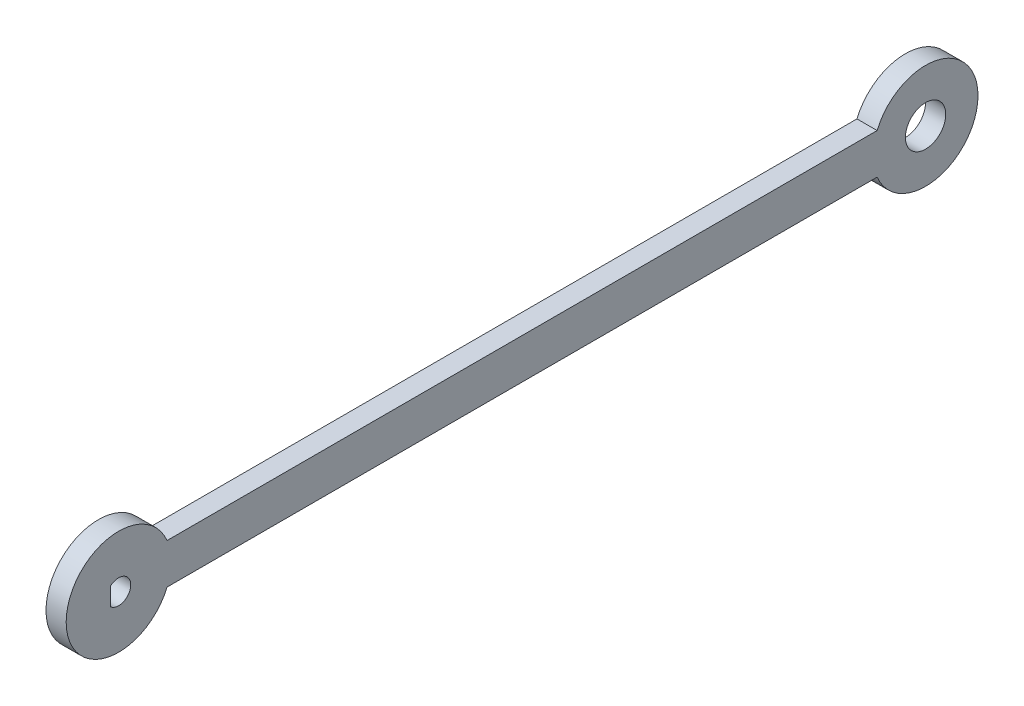
ISO-10303-21;
HEADER;
FILE_DESCRIPTION(('STEP AP214'),'2;1');
FILE_NAME('part.step','',(''),(''),'','','');
FILE_SCHEMA(('AUTOMOTIVE_DESIGN { 1 0 10303 214 1 1 1 1 }'));
ENDSEC;
DATA;
#1=APPLICATION_CONTEXT('core data for automotive mechanical design processes');
#2=APPLICATION_PROTOCOL_DEFINITION('international standard','automotive_design',2000,#1);
#3=PRODUCT_CONTEXT('',#1,'mechanical');
#4=PRODUCT('Part','Part','',(#3));
#5=PRODUCT_RELATED_PRODUCT_CATEGORY('part','',(#4));
#6=PRODUCT_DEFINITION_FORMATION('','',#4);
#7=PRODUCT_DEFINITION_CONTEXT('part definition',#1,'design');
#8=PRODUCT_DEFINITION('design','',#6,#7);
#9=PRODUCT_DEFINITION_SHAPE('','',#8);
#10=(LENGTH_UNIT() NAMED_UNIT(*) SI_UNIT(.MILLI.,.METRE.));
#11=(NAMED_UNIT(*) PLANE_ANGLE_UNIT() SI_UNIT($,.RADIAN.));
#12=(NAMED_UNIT(*) SI_UNIT($,.STERADIAN.) SOLID_ANGLE_UNIT());
#13=UNCERTAINTY_MEASURE_WITH_UNIT(LENGTH_MEASURE(1.E-05),#10,'distance_accuracy_value','');
#14=(GEOMETRIC_REPRESENTATION_CONTEXT(3) GLOBAL_UNCERTAINTY_ASSIGNED_CONTEXT((#13)) GLOBAL_UNIT_ASSIGNED_CONTEXT((#10,
#11,#12)) REPRESENTATION_CONTEXT('',''));
#15=CARTESIAN_POINT('',(0.,0.,0.));
#16=DIRECTION('',(0.,0.,1.));
#17=DIRECTION('',(1.,0.,0.));
#18=AXIS2_PLACEMENT_3D('',#15,#16,#17);
#19=CARTESIAN_POINT('',(5.,0.,-200.));
#20=DIRECTION('',(1.,0.,0.));
#21=DIRECTION('',(0.,0.,-1.));
#22=AXIS2_PLACEMENT_3D('',#19,#20,#21);
#23=PLANE('',#22);
#24=DIRECTION('',(0.,-1.,0.));
#25=VECTOR('',#24,1.);
#26=CARTESIAN_POINT('',(5.,0.,2.));
#27=LINE('',#26,#25);
#28=CARTESIAN_POINT('',(5.,2.23606797749979,2.));
#29=VERTEX_POINT('',#28);
#30=CARTESIAN_POINT('',(5.,-2.23606797749979,2.));
#31=VERTEX_POINT('',#30);
#32=EDGE_CURVE('E84',#29,#31,#27,.T.);
#33=ORIENTED_EDGE('',*,*,#32,.F.);
#34=CARTESIAN_POINT('',(5.,0.,0.));
#35=DIRECTION('',(1.,0.,0.));
#36=DIRECTION('',(0.,0.,-1.));
#37=AXIS2_PLACEMENT_3D('',#34,#35,#36);
#38=CIRCLE('',#37,3.);
#39=EDGE_CURVE('E90',#31,#29,#38,.T.);
#40=ORIENTED_EDGE('',*,*,#39,.F.);
#41=EDGE_LOOP('',(#33,#40));
#42=FACE_BOUND('',#41,.T.);
#43=CARTESIAN_POINT('',(5.,0.,-200.));
#44=DIRECTION('',(1.,0.,0.));
#45=DIRECTION('',(0.,0.,-1.));
#46=AXIS2_PLACEMENT_3D('',#43,#44,#45);
#47=CIRCLE('',#46,13.);
#48=CARTESIAN_POINT('',(5.,-5.,-188.));
#49=VERTEX_POINT('',#48);
#50=CARTESIAN_POINT('',(5.,5.,-188.));
#51=VERTEX_POINT('',#50);
#52=EDGE_CURVE('E106',#49,#51,#47,.T.);
#53=ORIENTED_EDGE('',*,*,#52,.T.);
#54=DIRECTION('',(0.,0.,1.));
#55=VECTOR('',#54,1.);
#56=CARTESIAN_POINT('',(5.,5.,-188.));
#57=LINE('',#56,#55);
#58=CARTESIAN_POINT('',(5.,5.,-12.));
#59=VERTEX_POINT('',#58);
#60=EDGE_CURVE('E109',#51,#59,#57,.T.);
#61=ORIENTED_EDGE('',*,*,#60,.T.);
#62=CARTESIAN_POINT('',(5.,0.,0.));
#63=DIRECTION('',(1.,0.,0.));
#64=DIRECTION('',(0.,0.,-1.));
#65=AXIS2_PLACEMENT_3D('',#62,#63,#64);
#66=CIRCLE('',#65,13.);
#67=CARTESIAN_POINT('',(5.,-5.,-12.));
#68=VERTEX_POINT('',#67);
#69=EDGE_CURVE('E112',#59,#68,#66,.T.);
#70=ORIENTED_EDGE('',*,*,#69,.T.);
#71=DIRECTION('',(0.,0.,-1.));
#72=VECTOR('',#71,1.);
#73=CARTESIAN_POINT('',(5.,-5.,-188.));
#74=LINE('',#73,#72);
#75=EDGE_CURVE('E114',#68,#49,#74,.T.);
#76=ORIENTED_EDGE('',*,*,#75,.T.);
#77=EDGE_LOOP('',(#53,#61,#70,#76));
#78=FACE_BOUND('',#77,.T.);
#79=CARTESIAN_POINT('',(5.,0.,-200.));
#80=DIRECTION('',(1.,0.,0.));
#81=DIRECTION('',(0.,0.,-1.));
#82=AXIS2_PLACEMENT_3D('',#79,#80,#81);
#83=CIRCLE('',#82,4.99999999999999);
#84=CARTESIAN_POINT('',(5.,0.,-205.));
#85=VERTEX_POINT('',#84);
#86=EDGE_CURVE('E102',#85,#85,#83,.T.);
#87=ORIENTED_EDGE('',*,*,#86,.F.);
#88=EDGE_LOOP('',(#87));
#89=FACE_BOUND('',#88,.T.);
#90=ADVANCED_FACE('F32',(#42,#78,#89),#23,.T.);
#91=CARTESIAN_POINT('',(0.,0.,-200.));
#92=DIRECTION('',(1.,0.,0.));
#93=DIRECTION('',(0.,0.,-1.));
#94=AXIS2_PLACEMENT_3D('',#91,#92,#93);
#95=PLANE('',#94);
#96=CARTESIAN_POINT('',(0.,0.,-200.));
#97=DIRECTION('',(1.,0.,0.));
#98=DIRECTION('',(0.,0.,-1.));
#99=AXIS2_PLACEMENT_3D('',#96,#97,#98);
#100=CIRCLE('',#99,13.);
#101=CARTESIAN_POINT('',(0.,-5.,-188.));
#102=VERTEX_POINT('',#101);
#103=CARTESIAN_POINT('',(0.,5.,-188.));
#104=VERTEX_POINT('',#103);
#105=EDGE_CURVE('E105',#102,#104,#100,.T.);
#106=ORIENTED_EDGE('',*,*,#105,.F.);
#107=DIRECTION('',(0.,0.,-1.));
#108=VECTOR('',#107,1.);
#109=CARTESIAN_POINT('',(0.,-5.,-188.));
#110=LINE('',#109,#108);
#111=CARTESIAN_POINT('',(0.,-5.,-12.));
#112=VERTEX_POINT('',#111);
#113=EDGE_CURVE('E110',#112,#102,#110,.T.);
#114=ORIENTED_EDGE('',*,*,#113,.F.);
#115=CARTESIAN_POINT('',(0.,0.,0.));
#116=DIRECTION('',(1.,0.,0.));
#117=DIRECTION('',(0.,0.,-1.));
#118=AXIS2_PLACEMENT_3D('',#115,#116,#117);
#119=CIRCLE('',#118,13.);
#120=CARTESIAN_POINT('',(0.,5.,-12.));
#121=VERTEX_POINT('',#120);
#122=EDGE_CURVE('E121',#121,#112,#119,.T.);
#123=ORIENTED_EDGE('',*,*,#122,.F.);
#124=DIRECTION('',(0.,0.,1.));
#125=VECTOR('',#124,1.);
#126=CARTESIAN_POINT('',(0.,5.,-188.));
#127=LINE('',#126,#125);
#128=EDGE_CURVE('E119',#104,#121,#127,.T.);
#129=ORIENTED_EDGE('',*,*,#128,.F.);
#130=EDGE_LOOP('',(#106,#114,#123,#129));
#131=FACE_BOUND('',#130,.T.);
#132=CARTESIAN_POINT('',(0.,0.,0.));
#133=DIRECTION('',(1.,0.,0.));
#134=DIRECTION('',(0.,0.,-1.));
#135=AXIS2_PLACEMENT_3D('',#132,#133,#134);
#136=CIRCLE('',#135,3.);
#137=CARTESIAN_POINT('',(0.,-2.23606797749979,2.));
#138=VERTEX_POINT('',#137);
#139=CARTESIAN_POINT('',(0.,2.23606797749979,2.));
#140=VERTEX_POINT('',#139);
#141=EDGE_CURVE('E54',#138,#140,#136,.T.);
#142=ORIENTED_EDGE('',*,*,#141,.T.);
#143=DIRECTION('',(0.,-1.,0.));
#144=VECTOR('',#143,1.);
#145=CARTESIAN_POINT('',(0.,0.,2.));
#146=LINE('',#145,#144);
#147=EDGE_CURVE('E95',#140,#138,#146,.T.);
#148=ORIENTED_EDGE('',*,*,#147,.T.);
#149=EDGE_LOOP('',(#142,#148));
#150=FACE_BOUND('',#149,.T.);
#151=CARTESIAN_POINT('',(0.,0.,-200.));
#152=DIRECTION('',(1.,0.,0.));
#153=DIRECTION('',(0.,0.,-1.));
#154=AXIS2_PLACEMENT_3D('',#151,#152,#153);
#155=CIRCLE('',#154,4.99999999999999);
#156=CARTESIAN_POINT('',(0.,0.,-205.));
#157=VERTEX_POINT('',#156);
#158=EDGE_CURVE('E99',#157,#157,#155,.T.);
#159=ORIENTED_EDGE('',*,*,#158,.T.);
#160=EDGE_LOOP('',(#159));
#161=FACE_BOUND('',#160,.T.);
#162=ADVANCED_FACE('F139',(#131,#150,#161),#95,.F.);
#163=CARTESIAN_POINT('',(5.,0.,-200.));
#164=DIRECTION('',(-1.,0.,0.));
#165=DIRECTION('',(0.,0.,1.));
#166=AXIS2_PLACEMENT_3D('',#163,#164,#165);
#167=CYLINDRICAL_SURFACE('',#166,13.);
#168=ORIENTED_EDGE('',*,*,#105,.T.);
#169=DIRECTION('',(-1.,0.,0.));
#170=VECTOR('',#169,1.);
#171=CARTESIAN_POINT('',(5.,5.,-188.));
#172=LINE('',#171,#170);
#173=EDGE_CURVE('E11',#51,#104,#172,.T.);
#174=ORIENTED_EDGE('',*,*,#173,.F.);
#175=ORIENTED_EDGE('',*,*,#52,.F.);
#176=DIRECTION('',(-1.,0.,0.));
#177=VECTOR('',#176,1.);
#178=CARTESIAN_POINT('',(5.,-5.,-188.));
#179=LINE('',#178,#177);
#180=EDGE_CURVE('E116',#49,#102,#179,.T.);
#181=ORIENTED_EDGE('',*,*,#180,.T.);
#182=EDGE_LOOP('',(#168,#174,#175,#181));
#183=FACE_BOUND('',#182,.T.);
#184=ADVANCED_FACE('F34',(#183),#167,.T.);
#185=CARTESIAN_POINT('',(5.,5.,-188.));
#186=DIRECTION('',(0.,-1.,0.));
#187=DIRECTION('',(0.,0.,-1.));
#188=AXIS2_PLACEMENT_3D('',#185,#186,#187);
#189=PLANE('',#188);
#190=ORIENTED_EDGE('',*,*,#128,.T.);
#191=DIRECTION('',(-1.,0.,0.));
#192=VECTOR('',#191,1.);
#193=CARTESIAN_POINT('',(5.,5.,-12.));
#194=LINE('',#193,#192);
#195=EDGE_CURVE('E40',#59,#121,#194,.T.);
#196=ORIENTED_EDGE('',*,*,#195,.F.);
#197=ORIENTED_EDGE('',*,*,#60,.F.);
#198=ORIENTED_EDGE('',*,*,#173,.T.);
#199=EDGE_LOOP('',(#190,#196,#197,#198));
#200=FACE_BOUND('',#199,.T.);
#201=ADVANCED_FACE('F149',(#200),#189,.F.);
#202=CARTESIAN_POINT('',(5.,0.,0.));
#203=DIRECTION('',(-1.,0.,0.));
#204=DIRECTION('',(0.,0.,1.));
#205=AXIS2_PLACEMENT_3D('',#202,#203,#204);
#206=CYLINDRICAL_SURFACE('',#205,13.);
#207=ORIENTED_EDGE('',*,*,#122,.T.);
#208=DIRECTION('',(-1.,0.,0.));
#209=VECTOR('',#208,1.);
#210=CARTESIAN_POINT('',(5.,-5.,-12.));
#211=LINE('',#210,#209);
#212=EDGE_CURVE('E126',#68,#112,#211,.T.);
#213=ORIENTED_EDGE('',*,*,#212,.F.);
#214=ORIENTED_EDGE('',*,*,#69,.F.);
#215=ORIENTED_EDGE('',*,*,#195,.T.);
#216=EDGE_LOOP('',(#207,#213,#214,#215));
#217=FACE_BOUND('',#216,.T.);
#218=ADVANCED_FACE('F133',(#217),#206,.T.);
#219=CARTESIAN_POINT('',(5.,-5.,-188.));
#220=DIRECTION('',(0.,1.,0.));
#221=DIRECTION('',(0.,0.,1.));
#222=AXIS2_PLACEMENT_3D('',#219,#220,#221);
#223=PLANE('',#222);
#224=ORIENTED_EDGE('',*,*,#113,.T.);
#225=ORIENTED_EDGE('',*,*,#180,.F.);
#226=ORIENTED_EDGE('',*,*,#75,.F.);
#227=ORIENTED_EDGE('',*,*,#212,.T.);
#228=EDGE_LOOP('',(#224,#225,#226,#227));
#229=FACE_BOUND('',#228,.T.);
#230=ADVANCED_FACE('F143',(#229),#223,.F.);
#231=CARTESIAN_POINT('',(5.,0.,0.));
#232=DIRECTION('',(-1.,0.,0.));
#233=DIRECTION('',(0.,0.,1.));
#234=AXIS2_PLACEMENT_3D('',#231,#232,#233);
#235=CYLINDRICAL_SURFACE('',#234,3.);
#236=ORIENTED_EDGE('',*,*,#141,.F.);
#237=DIRECTION('',(-1.,0.,0.));
#238=VECTOR('',#237,1.);
#239=CARTESIAN_POINT('',(5.,-2.23606797749979,2.));
#240=LINE('',#239,#238);
#241=EDGE_CURVE('E86',#31,#138,#240,.T.);
#242=ORIENTED_EDGE('',*,*,#241,.F.);
#243=ORIENTED_EDGE('',*,*,#39,.T.);
#244=DIRECTION('',(-1.,0.,0.));
#245=VECTOR('',#244,1.);
#246=CARTESIAN_POINT('',(5.,2.23606797749979,2.));
#247=LINE('',#246,#245);
#248=EDGE_CURVE('E47',#29,#140,#247,.T.);
#249=ORIENTED_EDGE('',*,*,#248,.T.);
#250=EDGE_LOOP('',(#236,#242,#243,#249));
#251=FACE_BOUND('',#250,.T.);
#252=ADVANCED_FACE('F92',(#251),#235,.F.);
#253=CARTESIAN_POINT('',(5.,0.,2.));
#254=DIRECTION('',(0.,0.,-1.));
#255=DIRECTION('',(-1.,0.,0.));
#256=AXIS2_PLACEMENT_3D('',#253,#254,#255);
#257=PLANE('',#256);
#258=ORIENTED_EDGE('',*,*,#147,.F.);
#259=ORIENTED_EDGE('',*,*,#248,.F.);
#260=ORIENTED_EDGE('',*,*,#32,.T.);
#261=ORIENTED_EDGE('',*,*,#241,.T.);
#262=EDGE_LOOP('',(#258,#259,#260,#261));
#263=FACE_BOUND('',#262,.T.);
#264=ADVANCED_FACE('F85',(#263),#257,.T.);
#265=CARTESIAN_POINT('',(5.,0.,-200.));
#266=DIRECTION('',(-1.,0.,0.));
#267=DIRECTION('',(0.,0.,1.));
#268=AXIS2_PLACEMENT_3D('',#265,#266,#267);
#269=CYLINDRICAL_SURFACE('',#268,4.99999999999999);
#270=ORIENTED_EDGE('',*,*,#86,.T.);
#271=EDGE_LOOP('',(#270));
#272=FACE_BOUND('',#271,.T.);
#273=ORIENTED_EDGE('',*,*,#158,.F.);
#274=EDGE_LOOP('',(#273));
#275=FACE_BOUND('',#274,.T.);
#276=ADVANCED_FACE('F172',(#272,#275),#269,.F.);
#277=CLOSED_SHELL('',(#90,#162,#184,#201,#218,#230,#252,#264,#276));
#278=MANIFOLD_SOLID_BREP('B2',#277);
#279=ADVANCED_BREP_SHAPE_REPRESENTATION('',(#18,#278),#14);
#280=SHAPE_DEFINITION_REPRESENTATION(#9,#279);
ENDSEC;
END-ISO-10303-21;
